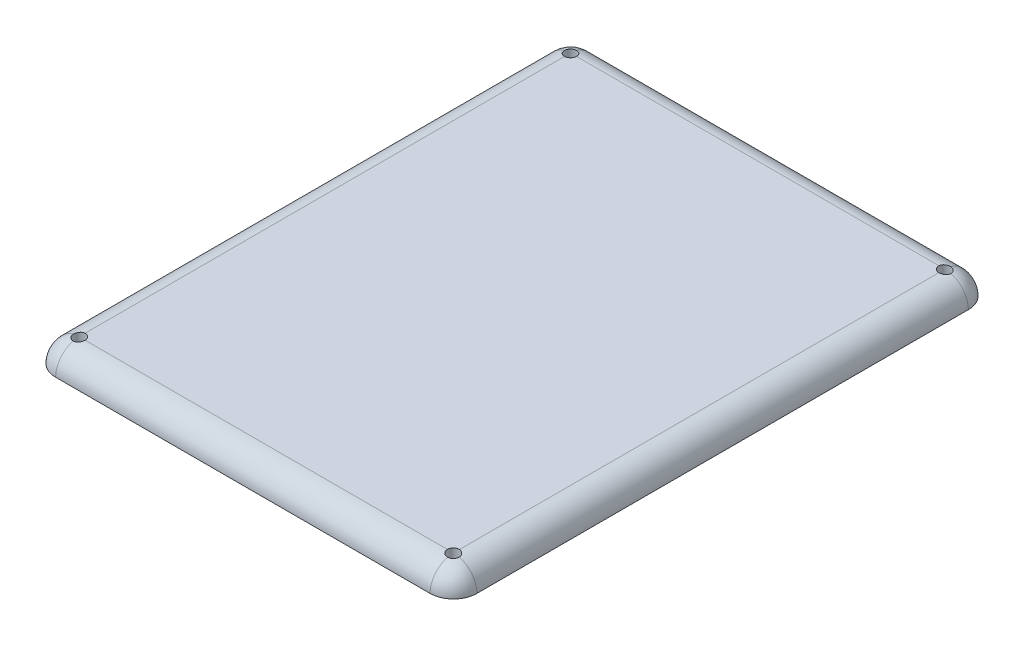
ISO-10303-21;
HEADER;
FILE_DESCRIPTION(('STEP AP214'),'2;1');
FILE_NAME('part.step','',(''),(''),'','','');
FILE_SCHEMA(('AUTOMOTIVE_DESIGN { 1 0 10303 214 1 1 1 1 }'));
ENDSEC;
DATA;
#1=APPLICATION_CONTEXT('core data for automotive mechanical design processes');
#2=APPLICATION_PROTOCOL_DEFINITION('international standard','automotive_design',2000,#1);
#3=PRODUCT_CONTEXT('',#1,'mechanical');
#4=PRODUCT('Part','Part','',(#3));
#5=PRODUCT_RELATED_PRODUCT_CATEGORY('part','',(#4));
#6=PRODUCT_DEFINITION_FORMATION('','',#4);
#7=PRODUCT_DEFINITION_CONTEXT('part definition',#1,'design');
#8=PRODUCT_DEFINITION('design','',#6,#7);
#9=PRODUCT_DEFINITION_SHAPE('','',#8);
#10=(LENGTH_UNIT() NAMED_UNIT(*) SI_UNIT(.MILLI.,.METRE.));
#11=(NAMED_UNIT(*) PLANE_ANGLE_UNIT() SI_UNIT($,.RADIAN.));
#12=(NAMED_UNIT(*) SI_UNIT($,.STERADIAN.) SOLID_ANGLE_UNIT());
#13=UNCERTAINTY_MEASURE_WITH_UNIT(LENGTH_MEASURE(1.E-05),#10,'distance_accuracy_value','');
#14=(GEOMETRIC_REPRESENTATION_CONTEXT(3) GLOBAL_UNCERTAINTY_ASSIGNED_CONTEXT((#13)) GLOBAL_UNIT_ASSIGNED_CONTEXT((#10,
#11,#12)) REPRESENTATION_CONTEXT('',''));
#15=CARTESIAN_POINT('',(0.,0.,0.));
#16=DIRECTION('',(0.,0.,1.));
#17=DIRECTION('',(1.,0.,0.));
#18=AXIS2_PLACEMENT_3D('',#15,#16,#17);
#19=CARTESIAN_POINT('',(0.,-2.5,33.4666536167725));
#20=DIRECTION('',(-1.,0.,0.));
#21=DIRECTION('',(0.,0.,1.));
#22=AXIS2_PLACEMENT_3D('',#19,#20,#21);
#23=CYLINDRICAL_SURFACE('',#22,2.5);
#24=DIRECTION('',(-1.,0.,0.));
#25=VECTOR('',#24,1.);
#26=CARTESIAN_POINT('',(0.,-5.,33.4666536167725));
#27=LINE('',#26,#25);
#28=CARTESIAN_POINT('',(40.,-5.,33.4666536167725));
#29=VERTEX_POINT('',#28);
#30=CARTESIAN_POINT('',(14.5,-5.,33.4666536167725));
#31=VERTEX_POINT('',#30);
#32=EDGE_CURVE('E208',#29,#31,#27,.T.);
#33=ORIENTED_EDGE('',*,*,#32,.T.);
#34=CARTESIAN_POINT('',(14.5,-2.5,33.4666536167725));
#35=DIRECTION('',(1.,0.,0.));
#36=DIRECTION('',(0.,0.,-1.));
#37=AXIS2_PLACEMENT_3D('',#34,#35,#36);
#38=CIRCLE('',#37,2.5);
#39=CARTESIAN_POINT('',(14.5,-2.5,30.9666536167725));
#40=VERTEX_POINT('',#39);
#41=EDGE_CURVE('E222',#40,#31,#38,.F.);
#42=ORIENTED_EDGE('',*,*,#41,.F.);
#43=DIRECTION('',(1.,0.,0.));
#44=VECTOR('',#43,1.);
#45=CARTESIAN_POINT('',(0.,-2.5,30.9666536167725));
#46=LINE('',#45,#44);
#47=CARTESIAN_POINT('',(40.,-2.5,30.9666536167725));
#48=VERTEX_POINT('',#47);
#49=EDGE_CURVE('E219',#48,#40,#46,.F.);
#50=ORIENTED_EDGE('',*,*,#49,.F.);
#51=CARTESIAN_POINT('',(40.,-2.5,33.4666536167725));
#52=DIRECTION('',(-1.,0.,0.));
#53=DIRECTION('',(0.,0.,1.));
#54=AXIS2_PLACEMENT_3D('',#51,#52,#53);
#55=CIRCLE('',#54,2.5);
#56=EDGE_CURVE('E156',#29,#48,#55,.F.);
#57=ORIENTED_EDGE('',*,*,#56,.F.);
#58=EDGE_LOOP('',(#33,#42,#50,#57));
#59=FACE_BOUND('',#58,.T.);
#60=ADVANCED_FACE('F33',(#59),#23,.T.);
#61=CARTESIAN_POINT('',(0.,-2.5,33.4666536167725));
#62=DIRECTION('',(1.,0.,0.));
#63=DIRECTION('',(0.,0.,-1.));
#64=AXIS2_PLACEMENT_3D('',#61,#62,#63);
#65=CYLINDRICAL_SURFACE('',#64,2.5);
#66=ORIENTED_EDGE('',*,*,#32,.F.);
#67=CARTESIAN_POINT('',(40.,-2.5,33.4666536167725));
#68=DIRECTION('',(-1.,0.,0.));
#69=DIRECTION('',(0.,0.,1.));
#70=AXIS2_PLACEMENT_3D('',#67,#68,#69);
#71=CIRCLE('',#70,2.5);
#72=CARTESIAN_POINT('',(40.,-2.5,35.9666536167725));
#73=VERTEX_POINT('',#72);
#74=EDGE_CURVE('E214',#73,#29,#71,.F.);
#75=ORIENTED_EDGE('',*,*,#74,.F.);
#76=DIRECTION('',(-1.,0.,0.));
#77=VECTOR('',#76,1.);
#78=CARTESIAN_POINT('',(0.,-2.5,35.9666536167725));
#79=LINE('',#78,#77);
#80=CARTESIAN_POINT('',(14.5,-2.5,35.9666536167725));
#81=VERTEX_POINT('',#80);
#82=EDGE_CURVE('E211',#81,#73,#79,.F.);
#83=ORIENTED_EDGE('',*,*,#82,.F.);
#84=CARTESIAN_POINT('',(14.5,-2.5,33.4666536167725));
#85=DIRECTION('',(1.,0.,0.));
#86=DIRECTION('',(0.,0.,-1.));
#87=AXIS2_PLACEMENT_3D('',#84,#85,#86);
#88=CIRCLE('',#87,2.5);
#89=EDGE_CURVE('E217',#31,#81,#88,.F.);
#90=ORIENTED_EDGE('',*,*,#89,.F.);
#91=EDGE_LOOP('',(#66,#75,#83,#90));
#92=FACE_BOUND('',#91,.T.);
#93=ADVANCED_FACE('F375',(#92),#65,.T.);
#94=CARTESIAN_POINT('',(0.,0.,0.));
#95=DIRECTION('',(0.,1.,0.));
#96=DIRECTION('',(0.,0.,1.));
#97=AXIS2_PLACEMENT_3D('',#94,#95,#96);
#98=PLANE('',#97);
#99=CARTESIAN_POINT('',(-40.,0.,-52.5));
#100=DIRECTION('',(0.,-1.,0.));
#101=DIRECTION('',(0.,0.,-1.));
#102=AXIS2_PLACEMENT_3D('',#99,#100,#101);
#103=CIRCLE('',#102,1.27);
#104=CARTESIAN_POINT('',(-40.,0.,-53.77));
#105=VERTEX_POINT('',#104);
#106=EDGE_CURVE('E523',#105,#105,#103,.T.);
#107=ORIENTED_EDGE('',*,*,#106,.F.);
#108=EDGE_LOOP('',(#107));
#109=FACE_BOUND('',#108,.T.);
#110=CARTESIAN_POINT('',(40.0039696980953,0.,-52.4698330388507));
#111=DIRECTION('',(0.,-1.,0.));
#112=DIRECTION('',(0.,0.,-1.));
#113=AXIS2_PLACEMENT_3D('',#110,#111,#112);
#114=CIRCLE('',#113,1.27);
#115=CARTESIAN_POINT('',(40.0039696980953,0.,-53.7398330388507));
#116=VERTEX_POINT('',#115);
#117=EDGE_CURVE('E526',#116,#116,#114,.T.);
#118=ORIENTED_EDGE('',*,*,#117,.F.);
#119=EDGE_LOOP('',(#118));
#120=FACE_BOUND('',#119,.T.);
#121=CARTESIAN_POINT('',(39.961684065126,0.,52.4945241091819));
#122=DIRECTION('',(0.,-1.,0.));
#123=DIRECTION('',(0.,0.,-1.));
#124=AXIS2_PLACEMENT_3D('',#121,#122,#123);
#125=CIRCLE('',#124,1.27);
#126=CARTESIAN_POINT('',(39.961684065126,0.,51.2245241091819));
#127=VERTEX_POINT('',#126);
#128=EDGE_CURVE('E534',#127,#127,#125,.T.);
#129=ORIENTED_EDGE('',*,*,#128,.F.);
#130=EDGE_LOOP('',(#129));
#131=FACE_BOUND('',#130,.T.);
#132=CARTESIAN_POINT('',(-39.9807499635397,0.,52.4822003056882));
#133=DIRECTION('',(0.,-1.,0.));
#134=DIRECTION('',(0.,0.,-1.));
#135=AXIS2_PLACEMENT_3D('',#132,#133,#134);
#136=CIRCLE('',#135,1.27);
#137=CARTESIAN_POINT('',(-39.9807499635397,0.,51.2122003056882));
#138=VERTEX_POINT('',#137);
#139=EDGE_CURVE('E531',#138,#138,#136,.T.);
#140=ORIENTED_EDGE('',*,*,#139,.F.);
#141=EDGE_LOOP('',(#140));
#142=FACE_BOUND('',#141,.T.);
#143=DIRECTION('',(0.,0.,1.));
#144=VECTOR('',#143,1.);
#145=CARTESIAN_POINT('',(-45.,0.,-57.5));
#146=LINE('',#145,#144);
#147=CARTESIAN_POINT('',(-45.,0.,-52.5));
#148=VERTEX_POINT('',#147);
#149=CARTESIAN_POINT('',(-45.,0.,52.5));
#150=VERTEX_POINT('',#149);
#151=EDGE_CURVE('E257',#148,#150,#146,.T.);
#152=ORIENTED_EDGE('',*,*,#151,.F.);
#153=CARTESIAN_POINT('',(-40.,0.,-52.5));
#154=DIRECTION('',(0.,1.,0.));
#155=DIRECTION('',(0.,0.,1.));
#156=AXIS2_PLACEMENT_3D('',#153,#154,#155);
#157=CIRCLE('',#156,5.);
#158=CARTESIAN_POINT('',(-40.,0.,-57.5));
#159=VERTEX_POINT('',#158);
#160=EDGE_CURVE('E194',#148,#159,#157,.F.);
#161=ORIENTED_EDGE('',*,*,#160,.T.);
#162=DIRECTION('',(-1.,0.,0.));
#163=VECTOR('',#162,1.);
#164=CARTESIAN_POINT('',(-45.,0.,-57.5));
#165=LINE('',#164,#163);
#166=CARTESIAN_POINT('',(39.9999999999999,0.,-57.5));
#167=VERTEX_POINT('',#166);
#168=EDGE_CURVE('E254',#167,#159,#165,.T.);
#169=ORIENTED_EDGE('',*,*,#168,.F.);
#170=CARTESIAN_POINT('',(40.,0.,-52.5));
#171=DIRECTION('',(0.,1.,0.));
#172=DIRECTION('',(0.,0.,1.));
#173=AXIS2_PLACEMENT_3D('',#170,#171,#172);
#174=CIRCLE('',#173,5.);
#175=CARTESIAN_POINT('',(45.,0.,-52.5));
#176=VERTEX_POINT('',#175);
#177=EDGE_CURVE('E191',#167,#176,#174,.F.);
#178=ORIENTED_EDGE('',*,*,#177,.T.);
#179=DIRECTION('',(0.,0.,-1.));
#180=VECTOR('',#179,1.);
#181=CARTESIAN_POINT('',(45.,0.,-57.5));
#182=LINE('',#181,#180);
#183=CARTESIAN_POINT('',(45.,0.,52.5));
#184=VERTEX_POINT('',#183);
#185=EDGE_CURVE('E251',#184,#176,#182,.T.);
#186=ORIENTED_EDGE('',*,*,#185,.F.);
#187=CARTESIAN_POINT('',(40.,0.,52.5));
#188=DIRECTION('',(0.,1.,0.));
#189=DIRECTION('',(0.,0.,1.));
#190=AXIS2_PLACEMENT_3D('',#187,#188,#189);
#191=CIRCLE('',#190,5.);
#192=CARTESIAN_POINT('',(40.,0.,57.5));
#193=VERTEX_POINT('',#192);
#194=EDGE_CURVE('E184',#184,#193,#191,.F.);
#195=ORIENTED_EDGE('',*,*,#194,.T.);
#196=DIRECTION('',(1.,0.,0.));
#197=VECTOR('',#196,1.);
#198=CARTESIAN_POINT('',(-45.,0.,57.5));
#199=LINE('',#198,#197);
#200=CARTESIAN_POINT('',(-40.,0.,57.5));
#201=VERTEX_POINT('',#200);
#202=EDGE_CURVE('E259',#201,#193,#199,.T.);
#203=ORIENTED_EDGE('',*,*,#202,.F.);
#204=CARTESIAN_POINT('',(-40.,0.,52.5));
#205=DIRECTION('',(0.,1.,0.));
#206=DIRECTION('',(0.,0.,1.));
#207=AXIS2_PLACEMENT_3D('',#204,#205,#206);
#208=CIRCLE('',#207,5.);
#209=EDGE_CURVE('E170',#201,#150,#208,.F.);
#210=ORIENTED_EDGE('',*,*,#209,.T.);
#211=EDGE_LOOP('',(#152,#161,#169,#178,#186,#195,#203,#210));
#212=FACE_BOUND('',#211,.T.);
#213=DIRECTION('',(0.,0.,1.));
#214=VECTOR('',#213,1.);
#215=CARTESIAN_POINT('',(40.,0.,35.9666536167725));
#216=LINE('',#215,#214);
#217=CARTESIAN_POINT('',(40.,0.,30.9666536167725));
#218=VERTEX_POINT('',#217);
#219=CARTESIAN_POINT('',(40.,0.,35.9666536167725));
#220=VERTEX_POINT('',#219);
#221=EDGE_CURVE('E359',#218,#220,#216,.T.);
#222=ORIENTED_EDGE('',*,*,#221,.F.);
#223=DIRECTION('',(1.,0.,0.));
#224=VECTOR('',#223,1.);
#225=CARTESIAN_POINT('',(14.5,0.,30.9666536167725));
#226=LINE('',#225,#224);
#227=CARTESIAN_POINT('',(14.5,0.,30.9666536167725));
#228=VERTEX_POINT('',#227);
#229=EDGE_CURVE('E239',#228,#218,#226,.T.);
#230=ORIENTED_EDGE('',*,*,#229,.F.);
#231=DIRECTION('',(0.,0.,-1.));
#232=VECTOR('',#231,1.);
#233=CARTESIAN_POINT('',(14.5,0.,35.9666536167725));
#234=LINE('',#233,#232);
#235=CARTESIAN_POINT('',(14.5,0.,35.9666536167725));
#236=VERTEX_POINT('',#235);
#237=EDGE_CURVE('E244',#236,#228,#234,.T.);
#238=ORIENTED_EDGE('',*,*,#237,.F.);
#239=DIRECTION('',(-1.,0.,0.));
#240=VECTOR('',#239,1.);
#241=CARTESIAN_POINT('',(14.5,0.,35.9666536167725));
#242=LINE('',#241,#240);
#243=EDGE_CURVE('E362',#220,#236,#242,.T.);
#244=ORIENTED_EDGE('',*,*,#243,.F.);
#245=EDGE_LOOP('',(#222,#230,#238,#244));
#246=FACE_BOUND('',#245,.T.);
#247=ADVANCED_FACE('F273',(#109,#120,#131,#142,#212,#246),#98,.F.);
#248=CARTESIAN_POINT('',(-45.,0.,-52.5));
#249=DIRECTION('',(-1.,0.,0.));
#250=DIRECTION('',(0.,0.,1.));
#251=AXIS2_PLACEMENT_3D('',#248,#249,#250);
#252=CYLINDRICAL_SURFACE('',#251,5.);
#253=CARTESIAN_POINT('',(-38.73,5.,-52.5));
#254=CARTESIAN_POINT('',(-38.7299995996187,5.00000203295582,-52.5351321659607));
#255=CARTESIAN_POINT('',(-38.7314587312449,4.99962926670162,-52.5702469753213));
#256=CARTESIAN_POINT('',(-38.7372756058334,4.99815578087302,-52.6402147633546));
#257=CARTESIAN_POINT('',(-38.7416328882991,4.99705517694723,-52.6750677827344));
#258=CARTESIAN_POINT('',(-38.758988553853,4.99270226991928,-52.7787106859159));
#259=CARTESIAN_POINT('',(-38.7762710338951,4.98839862258342,-52.8467896044364));
#260=CARTESIAN_POINT('',(-38.8217032861913,4.9774494279623,-52.9789661902547));
#261=CARTESIAN_POINT('',(-38.8498526788867,4.97080396247258,-53.0430639965137));
#262=CARTESIAN_POINT('',(-38.9161817712107,4.95587736130695,-53.1656534732563));
#263=CARTESIAN_POINT('',(-38.9543642127523,4.94759577865341,-53.224143605256));
#264=CARTESIAN_POINT('',(-39.0405188259083,4.93010099562295,-53.3350573889194));
#265=CARTESIAN_POINT('',(-39.0886621435057,4.92087316378342,-53.3873457295386));
#266=CARTESIAN_POINT('',(-39.1930144880968,4.90262087894723,-53.4832062749795));
#267=CARTESIAN_POINT('',(-39.2492253152075,4.89359647186246,-53.5267765293113));
#268=CARTESIAN_POINT('',(-39.369188431991,4.87662255739769,-53.6046128484418));
#269=CARTESIAN_POINT('',(-39.4330451012587,4.86869211136373,-53.6387224043327));
#270=CARTESIAN_POINT('',(-39.5658019089936,4.85502668785504,-53.6956496106856));
#271=CARTESIAN_POINT('',(-39.6346978711574,4.84928991639445,-53.7184764926021));
#272=CARTESIAN_POINT('',(-39.7532993442147,4.84207012799078,-53.7467959756724));
#273=CARTESIAN_POINT('',(-39.802218613147,4.83981654105899,-53.7554832706852));
#274=CARTESIAN_POINT('',(-39.900749668177,4.83678554243176,-53.7670892556901));
#275=CARTESIAN_POINT('',(-39.9503610019617,4.83600720826293,-53.7700115505749));
#276=CARTESIAN_POINT('',(-40.,4.83602109176542,-53.77));
#277=B_SPLINE_CURVE_WITH_KNOTS('',3,(#253,#254,#255,#256,#257,#258,#259,#260,#261,#262,#263,
#264,#265,#266,#267,#268,#269,#270,#271,#272,#273,#274,#275,#276),.UNSPECIFIED.,.F.,.F.,(4,2,2,
2,2,2,2,2,2,2,2,4),(0.,0.105330059980314,0.210643387725724,0.420662498770928,0.630674274948831,
0.840743504650465,1.05477698383368,1.26885829513099,1.48629453405159,1.70355257148928,
1.8524189257438,2.00119216333591),.UNSPECIFIED.);
#278=CARTESIAN_POINT('',(-38.73,5.,-52.5));
#279=VERTEX_POINT('',#278);
#280=CARTESIAN_POINT('',(-40.,4.83602109176542,-53.77));
#281=VERTEX_POINT('',#280);
#282=EDGE_CURVE('E353',#279,#281,#277,.T.);
#283=ORIENTED_EDGE('',*,*,#282,.F.);
#284=DIRECTION('',(1.,0.,0.));
#285=VECTOR('',#284,1.);
#286=CARTESIAN_POINT('',(-45.,5.,-52.5));
#287=LINE('',#286,#285);
#288=CARTESIAN_POINT('',(38.734328034296,5.,-52.5));
#289=VERTEX_POINT('',#288);
#290=EDGE_CURVE('E197',#289,#279,#287,.F.);
#291=ORIENTED_EDGE('',*,*,#290,.F.);
#292=CARTESIAN_POINT('',(39.9999999999999,4.84384448759005,-53.7398268347005));
#293=CARTESIAN_POINT('',(39.9648448586189,4.84387021694012,-53.7397173670911));
#294=CARTESIAN_POINT('',(39.9297120286387,4.84427482824108,-53.7381464766285));
#295=CARTESIAN_POINT('',(39.8597188650228,4.84581628957946,-53.7321033349272));
#296=CARTESIAN_POINT('',(39.8248584863198,4.84695301580355,-53.727631574275));
#297=CARTESIAN_POINT('',(39.7212103751411,4.85141467176838,-53.7099306473658));
#298=CARTESIAN_POINT('',(39.6531494915465,4.8557915344908,-53.6924149080751));
#299=CARTESIAN_POINT('',(39.521049969666,4.86683138146361,-53.6465172489853));
#300=CARTESIAN_POINT('',(39.4570110213717,4.87349418925818,-53.6181361678801));
#301=CARTESIAN_POINT('',(39.3345678544691,4.88833757989485,-53.5513431495097));
#302=CARTESIAN_POINT('',(39.2761652269163,4.89651858941049,-53.5129283911525));
#303=CARTESIAN_POINT('',(39.1654234326997,4.91365433924292,-53.4262744450445));
#304=CARTESIAN_POINT('',(39.1132243320918,4.92262103579727,-53.3778586666855));
#305=CARTESIAN_POINT('',(39.0175905836341,4.94017957244828,-53.2729484585746));
#306=CARTESIAN_POINT('',(38.9741579737401,4.9487713250183,-53.2164521555378));
#307=CARTESIAN_POINT('',(38.8967661255866,4.96471720649954,-53.096081910014));
#308=CARTESIAN_POINT('',(38.862937913315,4.97205372097617,-53.0321213097886));
#309=CARTESIAN_POINT('',(38.8065897725286,4.98448147718996,-52.8992255091518));
#310=CARTESIAN_POINT('',(38.7840589779245,4.98957487582594,-52.8302951620338));
#311=CARTESIAN_POINT('',(38.7575507309066,4.99545696863117,-52.7173386553749));
#312=CARTESIAN_POINT('',(38.7497603895719,4.99715120710975,-52.6742180535728));
#313=CARTESIAN_POINT('',(38.738668809711,4.99942538390627,-52.5874237463061));
#314=CARTESIAN_POINT('',(38.7353625725409,5.00000656330252,-52.5437507115934));
#315=CARTESIAN_POINT('',(38.734328034296,5.,-52.5));
#316=B_SPLINE_CURVE_WITH_KNOTS('',3,(#292,#293,#294,#295,#296,#297,#298,#299,#300,#301,#302,
#303,#304,#305,#306,#307,#308,#309,#310,#311,#312,#313,#314,#315),.UNSPECIFIED.,.F.,.F.,(4,2,2,
2,2,2,2,2,2,2,2,4),(0.,0.105399304695815,0.210780789219215,0.420933299000074,0.631069590415775,
0.841265027957935,1.05554972200494,1.26988417382109,1.48701572672835,1.70393803550145,
1.8352652745166,1.9664459961555),.UNSPECIFIED.);
#317=CARTESIAN_POINT('',(40.,4.84384448759005,-53.7398268347005));
#318=VERTEX_POINT('',#317);
#319=EDGE_CURVE('E297',#318,#289,#316,.T.);
#320=ORIENTED_EDGE('',*,*,#319,.F.);
#321=CARTESIAN_POINT('',(40.,0.,-52.5));
#322=DIRECTION('',(1.,0.,0.));
#323=DIRECTION('',(0.,0.,-1.));
#324=AXIS2_PLACEMENT_3D('',#321,#322,#323);
#325=CIRCLE('',#324,5.);
#326=EDGE_CURVE('E205',#167,#318,#325,.T.);
#327=ORIENTED_EDGE('',*,*,#326,.F.);
#328=ORIENTED_EDGE('',*,*,#168,.T.);
#329=CARTESIAN_POINT('',(-40.,0.,-52.5));
#330=DIRECTION('',(1.,0.,0.));
#331=DIRECTION('',(0.,0.,-1.));
#332=AXIS2_PLACEMENT_3D('',#329,#330,#331);
#333=CIRCLE('',#332,5.);
#334=EDGE_CURVE('E202',#159,#281,#333,.T.);
#335=ORIENTED_EDGE('',*,*,#334,.T.);
#336=EDGE_LOOP('',(#283,#291,#320,#327,#328,#335));
#337=FACE_BOUND('',#336,.T.);
#338=ADVANCED_FACE('F343',(#337),#252,.T.);
#339=CARTESIAN_POINT('',(-40.,0.,-52.5));
#340=DIRECTION('',(0.,0.,1.));
#341=DIRECTION('',(1.,0.,0.));
#342=AXIS2_PLACEMENT_3D('',#339,#340,#341);
#343=SPHERICAL_SURFACE('',#342,5.);
#344=CARTESIAN_POINT('',(-40.,4.83602109176542,-52.5));
#345=DIRECTION('',(0.,-1.,0.));
#346=DIRECTION('',(0.,0.,-1.));
#347=AXIS2_PLACEMENT_3D('',#344,#345,#346);
#348=CIRCLE('',#347,1.27);
#349=CARTESIAN_POINT('',(-41.27,4.83602109176542,-52.5));
#350=VERTEX_POINT('',#349);
#351=EDGE_CURVE('E360',#281,#350,#348,.F.);
#352=ORIENTED_EDGE('',*,*,#351,.F.);
#353=ORIENTED_EDGE('',*,*,#334,.F.);
#354=ORIENTED_EDGE('',*,*,#160,.F.);
#355=CARTESIAN_POINT('',(-40.,0.,-52.5));
#356=DIRECTION('',(0.,0.,1.));
#357=DIRECTION('',(1.,0.,0.));
#358=AXIS2_PLACEMENT_3D('',#355,#356,#357);
#359=CIRCLE('',#358,5.);
#360=EDGE_CURVE('E189',#350,#148,#359,.T.);
#361=ORIENTED_EDGE('',*,*,#360,.F.);
#362=EDGE_LOOP('',(#352,#353,#354,#361));
#363=FACE_BOUND('',#362,.T.);
#364=ADVANCED_FACE('F347',(#363),#343,.T.);
#365=CARTESIAN_POINT('',(40.,0.,-52.5));
#366=DIRECTION('',(0.,0.,1.));
#367=DIRECTION('',(1.,0.,0.));
#368=AXIS2_PLACEMENT_3D('',#365,#366,#367);
#369=SPHERICAL_SURFACE('',#368,5.);
#370=CARTESIAN_POINT('',(41.2736160981766,4.83507000926205,-52.4998));
#371=CARTESIAN_POINT('',(41.272772736697,4.83529357608201,-52.5355216151164));
#372=CARTESIAN_POINT('',(41.270421763136,4.83551803603645,-52.5711905172025));
#373=CARTESIAN_POINT('',(41.2627253150764,4.83596734714724,-52.6422019978976));
#374=CARTESIAN_POINT('',(41.2573799841018,4.83619219828433,-52.6775445920647));
#375=CARTESIAN_POINT('',(41.2369055919987,4.83686454304082,-52.7826417887341));
#376=CARTESIAN_POINT('',(41.2173352164084,4.8373105698389,-52.8515843207398));
#377=CARTESIAN_POINT('',(41.1668981055198,4.83818517131952,-52.9852033688616));
#378=CARTESIAN_POINT('',(41.1360259312434,4.83861373748861,-53.0498778132483));
#379=CARTESIAN_POINT('',(41.0638650330066,4.83944125768495,-53.1731231095541));
#380=CARTESIAN_POINT('',(41.0225782768531,4.83984021728786,-53.2316951115622));
#381=CARTESIAN_POINT('',(40.9307604264063,4.84059722469046,-53.3410727804715));
#382=CARTESIAN_POINT('',(40.880229615333,4.84095527374302,-53.3918786852235));
#383=CARTESIAN_POINT('',(40.7713408541869,4.84162044662066,-53.4842989195479));
#384=CARTESIAN_POINT('',(40.712981049052,4.84192755833757,-53.5259110644755));
#385=CARTESIAN_POINT('',(40.5900963722029,4.84248210819778,-53.5987532964082));
#386=CARTESIAN_POINT('',(40.5255700685369,4.84272953243353,-53.6299809644061));
#387=CARTESIAN_POINT('',(40.3922086472042,4.84315751186499,-53.6811387653668));
#388=CARTESIAN_POINT('',(40.3233767422621,4.84333811624019,-53.7010772129652));
#389=CARTESIAN_POINT('',(40.211656966363,4.84356909928146,-53.7234615911803));
#390=CARTESIAN_POINT('',(40.1694960460023,4.84364262532504,-53.7297189898303));
#391=CARTESIAN_POINT('',(40.084827251508,4.84376339820416,-53.7379690371622));
#392=CARTESIAN_POINT('',(40.0423200420688,4.84381068698662,-53.7399685078357));
#393=CARTESIAN_POINT('',(39.9997999999999,4.8438446475055,-53.7398261937999));
#394=B_SPLINE_CURVE_WITH_KNOTS('',3,(#370,#371,#372,#373,#374,#375,#376,#377,#378,#379,#380,
#381,#382,#383,#384,#385,#386,#387,#388,#389,#390,#391,#392,#393),.UNSPECIFIED.,.F.,.F.,(4,2,2,
2,2,2,2,2,2,2,2,4),(0.,0.107130963004776,0.214256791502175,0.428157314947688,0.64216091339479,
0.856124106690702,1.07008074566348,1.28408817101018,1.49814541335296,1.71204479440481,
1.8397175613818,1.96718561848273),.UNSPECIFIED.);
#395=CARTESIAN_POINT('',(41.2736113618946,4.83507126099016,-52.5));
#396=VERTEX_POINT('',#395);
#397=EDGE_CURVE('E295',#396,#318,#394,.T.);
#398=ORIENTED_EDGE('',*,*,#397,.F.);
#399=CARTESIAN_POINT('',(40.,0.,-52.5));
#400=DIRECTION('',(0.,0.,-1.));
#401=DIRECTION('',(-1.,0.,0.));
#402=AXIS2_PLACEMENT_3D('',#399,#400,#401);
#403=CIRCLE('',#402,5.);
#404=EDGE_CURVE('E199',#176,#396,#403,.F.);
#405=ORIENTED_EDGE('',*,*,#404,.F.);
#406=ORIENTED_EDGE('',*,*,#177,.F.);
#407=ORIENTED_EDGE('',*,*,#326,.T.);
#408=EDGE_LOOP('',(#398,#405,#406,#407));
#409=FACE_BOUND('',#408,.T.);
#410=ADVANCED_FACE('F349',(#409),#369,.T.);
#411=CARTESIAN_POINT('',(40.,0.,-57.5));
#412=DIRECTION('',(0.,0.,-1.));
#413=DIRECTION('',(-1.,0.,0.));
#414=AXIS2_PLACEMENT_3D('',#411,#412,#413);
#415=CYLINDRICAL_SURFACE('',#414,5.);
#416=CARTESIAN_POINT('',(40.,5.,-51.1998392430009));
#417=CARTESIAN_POINT('',(40.0351290339948,5.00000203251723,-51.1997290370749));
#418=CARTESIAN_POINT('',(40.070245285554,4.99962933175562,-51.2010781661231));
#419=CARTESIAN_POINT('',(40.1402250842158,4.99815553412318,-51.2066753529627));
#420=CARTESIAN_POINT('',(40.1750886704344,4.99705455254525,-51.2109229519057));
#421=CARTESIAN_POINT('',(40.2787757958842,4.99269903344248,-51.2279515257193));
#422=CARTESIAN_POINT('',(40.3469018843077,4.98839167791927,-51.2450179134868));
#423=CARTESIAN_POINT('',(40.4792071374488,4.97742709843985,-51.2900279315692));
#424=CARTESIAN_POINT('',(40.5433864360846,4.97076995426592,-51.3179711925854));
#425=CARTESIAN_POINT('',(40.6661715583113,4.95580898731797,-51.3839029501204));
#426=CARTESIAN_POINT('',(40.7247757703665,4.94750469054477,-51.4218943392289));
#427=CARTESIAN_POINT('',(40.8359505269562,4.92995119337142,-51.5076835289175));
#428=CARTESIAN_POINT('',(40.8883861434812,4.92068710390797,-51.5556530568275));
#429=CARTESIAN_POINT('',(40.9845663374848,4.90234954535367,-51.6596794702949));
#430=CARTESIAN_POINT('',(41.0283093670852,4.89327611046923,-51.7157377931519));
#431=CARTESIAN_POINT('',(41.1065268374182,4.8761903524715,-51.8354358542976));
#432=CARTESIAN_POINT('',(41.1408432746344,4.86819714099412,-51.8991817332698));
#433=CARTESIAN_POINT('',(41.1982061213967,4.85439757019513,-52.0317593192806));
#434=CARTESIAN_POINT('',(41.2212598814122,4.84858978514787,-52.1005876754327));
#435=CARTESIAN_POINT('',(41.25130131711,4.84091244271311,-52.2246422152696));
#436=CARTESIAN_POINT('',(41.260798974104,4.83843638288464,-52.2792363182903));
#437=CARTESIAN_POINT('',(41.2726219095893,4.83533116823505,-52.3892411643202));
#438=CARTESIAN_POINT('',(41.2749477698873,4.83470186359751,-52.4446518407189));
#439=CARTESIAN_POINT('',(41.2736113618946,4.83507126099016,-52.5));
#440=B_SPLINE_CURVE_WITH_KNOTS('',3,(#416,#417,#418,#419,#420,#421,#422,#423,#424,#425,#426,
#427,#428,#429,#430,#431,#432,#433,#434,#435,#436,#437,#438,#439),.UNSPECIFIED.,.F.,.F.,(4,2,2,
2,2,2,2,2,2,2,2,4),(0.,0.105321209318235,0.210625749404867,0.420624345135475,0.630615811478709,
0.8406677947217,1.05468868283313,1.26874764729861,1.48620159884873,1.70351344110764,
1.86943940786819,2.03535191365516),.UNSPECIFIED.);
#441=CARTESIAN_POINT('',(40.,5.,-51.1998392430009));
#442=VERTEX_POINT('',#441);
#443=EDGE_CURVE('E292',#442,#396,#440,.T.);
#444=ORIENTED_EDGE('',*,*,#443,.F.);
#445=DIRECTION('',(0.,0.,1.));
#446=VECTOR('',#445,1.);
#447=CARTESIAN_POINT('',(40.,5.,-57.5));
#448=LINE('',#447,#446);
#449=CARTESIAN_POINT('',(40.,5.,51.225102237173));
#450=VERTEX_POINT('',#449);
#451=EDGE_CURVE('E172',#450,#442,#448,.F.);
#452=ORIENTED_EDGE('',*,*,#451,.F.);
#453=CARTESIAN_POINT('',(41.2316722598033,4.84592441588095,52.5));
#454=CARTESIAN_POINT('',(41.2318242099097,4.84588350914998,52.4648545016178));
#455=CARTESIAN_POINT('',(41.230515415421,4.84621868337919,52.4297196635229));
#456=CARTESIAN_POINT('',(41.2249956911847,4.84761777122258,52.3596990303946));
#457=CARTESIAN_POINT('',(41.2207852382419,4.84868156510873,52.3248131953962));
#458=CARTESIAN_POINT('',(41.2038623644401,4.85292275449124,52.2210531858894));
#459=CARTESIAN_POINT('',(41.1868590362807,4.85715000299196,52.1528712620706));
#460=CARTESIAN_POINT('',(41.1419563961496,4.86790108594956,52.0204421491884));
#461=CARTESIAN_POINT('',(41.1140576963725,4.8744247913699,51.9561947392851));
#462=CARTESIAN_POINT('',(41.0481880530312,4.88901176125209,51.8332589618242));
#463=CARTESIAN_POINT('',(41.0102143552581,4.89707544653013,51.7745721203257));
#464=CARTESIAN_POINT('',(40.9244157156901,4.91400028356667,51.6632097716243));
#465=CARTESIAN_POINT('',(40.8764165848422,4.922873718432,51.6106703759941));
#466=CARTESIAN_POINT('',(40.7722844175113,4.94027917543136,51.5142891963375));
#467=CARTESIAN_POINT('',(40.7161494619191,4.94881111640487,51.4704494702187));
#468=CARTESIAN_POINT('',(40.596415946624,4.96467326672085,51.3921623234911));
#469=CARTESIAN_POINT('',(40.5327270667747,4.97198574777263,51.3578493192841));
#470=CARTESIAN_POINT('',(40.4002918791342,4.98439289589521,51.3004897259598));
#471=CARTESIAN_POINT('',(40.3315504600223,4.98948967462823,51.2774324070889));
#472=CARTESIAN_POINT('',(40.2185463170214,4.99540588741907,51.2499899554751));
#473=CARTESIAN_POINT('',(40.1752115117014,4.99711846061645,51.2418292496479));
#474=CARTESIAN_POINT('',(40.0879484503932,4.99941827994406,51.2300496242595));
#475=CARTESIAN_POINT('',(40.0440208973087,5.00000675807147,51.2264257338964));
#476=CARTESIAN_POINT('',(40.,5.,51.225102237173));
#477=B_SPLINE_CURVE_WITH_KNOTS('',3,(#453,#454,#455,#456,#457,#458,#459,#460,#461,#462,#463,
#464,#465,#466,#467,#468,#469,#470,#471,#472,#473,#474,#475,#476),.UNSPECIFIED.,.F.,.F.,(4,2,2,
2,2,2,2,2,2,2,2,4),(0.,0.105371046327893,0.210724782056571,0.420824551743933,0.630912517935732,
0.841057975298021,1.0552142962079,1.26942121558509,1.48651244314226,1.70339631714857,
1.83555398586043,1.9675667277675),.UNSPECIFIED.);
#478=CARTESIAN_POINT('',(41.2316722598033,4.84592441588095,52.5));
#479=VERTEX_POINT('',#478);
#480=EDGE_CURVE('E291',#479,#450,#477,.T.);
#481=ORIENTED_EDGE('',*,*,#480,.F.);
#482=CARTESIAN_POINT('',(40.,0.,52.5));
#483=DIRECTION('',(0.,0.,1.));
#484=DIRECTION('',(1.,0.,0.));
#485=AXIS2_PLACEMENT_3D('',#482,#483,#484);
#486=CIRCLE('',#485,5.);
#487=EDGE_CURVE('E186',#184,#479,#486,.T.);
#488=ORIENTED_EDGE('',*,*,#487,.F.);
#489=ORIENTED_EDGE('',*,*,#185,.T.);
#490=ORIENTED_EDGE('',*,*,#404,.T.);
#491=EDGE_LOOP('',(#444,#452,#481,#488,#489,#490));
#492=FACE_BOUND('',#491,.T.);
#493=ADVANCED_FACE('F290',(#492),#415,.T.);
#494=CARTESIAN_POINT('',(40.,0.,52.5));
#495=DIRECTION('',(-1.,0.,0.));
#496=DIRECTION('',(0.,0.,1.));
#497=AXIS2_PLACEMENT_3D('',#494,#495,#496);
#498=SPHERICAL_SURFACE('',#497,5.);
#499=CARTESIAN_POINT('',(39.9998,4.83760532662576,53.763952002175));
#500=CARTESIAN_POINT('',(40.0355152253414,4.83788699277156,53.7628793754008));
#501=CARTESIAN_POINT('',(40.0711680860608,4.83816643391957,53.7602995262813));
#502=CARTESIAN_POINT('',(40.1421283283217,4.83871914648799,53.7521475091415));
#503=CARTESIAN_POINT('',(40.177435726303,4.83899241820282,53.7465754842246));
#504=CARTESIAN_POINT('',(40.2823994995716,4.83979956139933,53.7254269819143));
#505=CARTESIAN_POINT('',(40.3512153867241,4.84032169084551,53.7054144186055));
#506=CARTESIAN_POINT('',(40.4845089715493,4.84131870955862,53.6541202733023));
#507=CARTESIAN_POINT('',(40.5489845564618,4.84179357587198,53.6228332495655));
#508=CARTESIAN_POINT('',(40.6717648483995,4.84268262113191,53.5498820289846));
#509=CARTESIAN_POINT('',(40.7300707753982,4.84309681208253,53.5082198891758));
#510=CARTESIAN_POINT('',(40.8388558612707,4.84385279546965,53.4157022790408));
#511=CARTESIAN_POINT('',(40.8893354433861,4.84419459182154,53.3648473061771));
#512=CARTESIAN_POINT('',(40.9810547648404,4.84479626716235,53.2553676809508));
#513=CARTESIAN_POINT('',(41.0222920302937,4.84505612422618,53.1967409549946));
#514=CARTESIAN_POINT('',(41.0943456856079,4.84548651033048,53.0733882625516));
#515=CARTESIAN_POINT('',(41.1251593830097,4.84565701629736,53.0086607257073));
#516=CARTESIAN_POINT('',(41.1754584305368,4.84590366350892,52.8749734067679));
#517=CARTESIAN_POINT('',(41.1949533375359,4.84597988442362,52.8060172496097));
#518=CARTESIAN_POINT('',(41.216061615596,4.84602364383251,52.6970442035347));
#519=CARTESIAN_POINT('',(41.2217713334475,4.84602441814629,52.6577773102406));
#520=CARTESIAN_POINT('',(41.2294923096031,4.84599639076055,52.5789486877173));
#521=CARTESIAN_POINT('',(41.2315098101061,4.84596763910748,52.5393875698536));
#522=CARTESIAN_POINT('',(41.2316731064078,4.84592419657506,52.4998));
#523=B_SPLINE_CURVE_WITH_KNOTS('',3,(#499,#500,#501,#502,#503,#504,#505,#506,#507,#508,#509,
#510,#511,#512,#513,#514,#515,#516,#517,#518,#519,#520,#521,#522),.UNSPECIFIED.,.F.,.F.,(4,2,2,
2,2,2,2,2,2,2,2,4),(0.,0.107131475350803,0.214257827508276,0.428161058509463,0.642167670849167,
0.856131886637412,1.07008452739424,1.28409436851613,1.49815944729846,1.71204351917366,
1.83092804116959,1.94961138627004),.UNSPECIFIED.);
#524=CARTESIAN_POINT('',(40.,4.83760690389694,53.7639459811909));
#525=VERTEX_POINT('',#524);
#526=EDGE_CURVE('E281',#525,#479,#523,.T.);
#527=ORIENTED_EDGE('',*,*,#526,.F.);
#528=CARTESIAN_POINT('',(40.,0.,52.5));
#529=DIRECTION('',(1.,0.,0.));
#530=DIRECTION('',(0.,0.,-1.));
#531=AXIS2_PLACEMENT_3D('',#528,#529,#530);
#532=CIRCLE('',#531,5.);
#533=EDGE_CURVE('E181',#193,#525,#532,.F.);
#534=ORIENTED_EDGE('',*,*,#533,.F.);
#535=ORIENTED_EDGE('',*,*,#194,.F.);
#536=ORIENTED_EDGE('',*,*,#487,.T.);
#537=EDGE_LOOP('',(#527,#534,#535,#536));
#538=FACE_BOUND('',#537,.T.);
#539=ADVANCED_FACE('F280',(#538),#498,.T.);
#540=CARTESIAN_POINT('',(-40.,0.,52.5));
#541=DIRECTION('',(1.,0.,0.));
#542=DIRECTION('',(0.,0.,-1.));
#543=AXIS2_PLACEMENT_3D('',#540,#541,#542);
#544=SPHERICAL_SURFACE('',#543,5.);
#545=CARTESIAN_POINT('',(-41.2506280091646,4.84106698390893,52.4998));
#546=CARTESIAN_POINT('',(-41.2501326175029,4.84119637565459,52.5355270244185));
#547=CARTESIAN_POINT('',(-41.2481292645723,4.84131962620391,52.5712160528106));
#548=CARTESIAN_POINT('',(-41.241125194125,4.84155310879079,52.6422970386982));
#549=CARTESIAN_POINT('',(-41.2361246201066,4.84166334145129,52.6776890103337));
#550=CARTESIAN_POINT('',(-41.2166758296967,4.84197308835505,52.7829780276438));
#551=CARTESIAN_POINT('',(-41.1977787888004,4.8421520792268,52.8521064054612));
#552=CARTESIAN_POINT('',(-41.1486477935137,4.84244970416709,52.9862077355066));
#553=CARTESIAN_POINT('',(-41.1184083712462,4.84256830905996,53.0511786658218));
#554=CARTESIAN_POINT('',(-41.0474546604369,4.84274181561639,53.1751186546705));
#555=CARTESIAN_POINT('',(-41.0067424090347,4.84279672965746,53.2340888773319));
#556=CARTESIAN_POINT('',(-40.9159992977902,4.84284130446494,53.3443534563305));
#557=CARTESIAN_POINT('',(-40.8659687922517,4.84283096771187,53.3956481043791));
#558=CARTESIAN_POINT('',(-40.7579910101363,4.8427453286888,53.4891241279727));
#559=CARTESIAN_POINT('',(-40.7000417124258,4.84267000980709,53.5313031698002));
#560=CARTESIAN_POINT('',(-40.5778756657216,4.84245651999927,53.6053416949665));
#561=CARTESIAN_POINT('',(-40.5136572175518,4.84231833199591,53.6371983703933));
#562=CARTESIAN_POINT('',(-40.3808041214022,4.84198300264445,53.689654995461));
#563=CARTESIAN_POINT('',(-40.3121730610452,4.84178590872506,53.710263963726));
#564=CARTESIAN_POINT('',(-40.2024463608909,4.84143457413453,53.7333674367408));
#565=CARTESIAN_POINT('',(-40.1621472679776,4.84129813540693,53.7398398420459));
#566=CARTESIAN_POINT('',(-40.0811811739293,4.84100941482851,53.7488770516633));
#567=CARTESIAN_POINT('',(-40.0405148954014,4.84085715968025,53.7514483311968));
#568=CARTESIAN_POINT('',(-39.9998,4.84069748814727,53.7520574221036));
#569=B_SPLINE_CURVE_WITH_KNOTS('',3,(#545,#546,#547,#548,#549,#550,#551,#552,#553,#554,#555,
#556,#557,#558,#559,#560,#561,#562,#563,#564,#565,#566,#567,#568),.UNSPECIFIED.,.F.,.F.,(4,2,2,
2,2,2,2,2,2,2,2,4),(0.,0.107126240837692,0.214247353182462,0.428139362324229,0.642134616231362,
0.856088275931225,1.07003380222365,1.28403403672536,1.49809243524741,1.71197894459511,
1.83425632416681,1.95633052068861),.UNSPECIFIED.);
#570=CARTESIAN_POINT('',(-41.2506252215404,4.84106770818661,52.5));
#571=VERTEX_POINT('',#570);
#572=CARTESIAN_POINT('',(-40.,4.84069827239818,53.7520544060069));
#573=VERTEX_POINT('',#572);
#574=EDGE_CURVE('E165',#571,#573,#569,.T.);
#575=ORIENTED_EDGE('',*,*,#574,.F.);
#576=CARTESIAN_POINT('',(-40.,0.,52.5));
#577=DIRECTION('',(0.,0.,-1.));
#578=DIRECTION('',(-1.,0.,0.));
#579=AXIS2_PLACEMENT_3D('',#576,#577,#578);
#580=CIRCLE('',#579,5.);
#581=EDGE_CURVE('E163',#150,#571,#580,.T.);
#582=ORIENTED_EDGE('',*,*,#581,.F.);
#583=ORIENTED_EDGE('',*,*,#209,.F.);
#584=CARTESIAN_POINT('',(-40.,0.,52.5));
#585=DIRECTION('',(1.,0.,0.));
#586=DIRECTION('',(0.,0.,-1.));
#587=AXIS2_PLACEMENT_3D('',#584,#585,#586);
#588=CIRCLE('',#587,5.);
#589=EDGE_CURVE('E175',#573,#201,#588,.T.);
#590=ORIENTED_EDGE('',*,*,#589,.F.);
#591=EDGE_LOOP('',(#575,#582,#583,#590));
#592=FACE_BOUND('',#591,.T.);
#593=ADVANCED_FACE('F270',(#592),#544,.T.);
#594=CARTESIAN_POINT('',(-40.,0.,-57.5));
#595=DIRECTION('',(0.,0.,1.));
#596=DIRECTION('',(1.,0.,0.));
#597=AXIS2_PLACEMENT_3D('',#594,#595,#596);
#598=CYLINDRICAL_SURFACE('',#597,5.);
#599=CARTESIAN_POINT('',(-41.27,4.83602109176542,-52.5));
#600=CARTESIAN_POINT('',(-41.2700004500397,4.83601868201476,-52.464886353621));
#601=CARTESIAN_POINT('',(-41.2685428096875,4.83640401047006,-52.429790125857));
#602=CARTESIAN_POINT('',(-41.2627321979863,4.83792526027292,-52.3598605569281));
#603=CARTESIAN_POINT('',(-41.2583797259396,4.83906105217988,-52.3250271714756));
#604=CARTESIAN_POINT('',(-41.2410448966373,4.84354813021985,-52.2214501470163));
#605=CARTESIAN_POINT('',(-41.2237848341884,4.84797941131787,-52.1534188496602));
#606=CARTESIAN_POINT('',(-41.1784177909285,4.85920465767625,-52.0213402483421));
#607=CARTESIAN_POINT('',(-41.1503118428776,4.86599839797392,-51.957292565729));
#608=CARTESIAN_POINT('',(-41.0840843680952,4.88117932534767,-51.8347862564727));
#609=CARTESIAN_POINT('',(-41.0459597081607,4.88956701067873,-51.776329386087));
#610=CARTESIAN_POINT('',(-40.95986469951,4.90720128405333,-51.6653797293147));
#611=CARTESIAN_POINT('',(-40.9117101570291,4.91646185365654,-51.6130321405775));
#612=CARTESIAN_POINT('',(-40.807310725109,4.93467854786359,-51.5170568437099));
#613=CARTESIAN_POINT('',(-40.7510643021855,4.9436346143627,-51.4734307921426));
#614=CARTESIAN_POINT('',(-40.6310669250864,4.96039052348539,-51.3955332213484));
#615=CARTESIAN_POINT('',(-40.5672177756194,4.96817142630137,-51.3614087008485));
#616=CARTESIAN_POINT('',(-40.4344755529386,4.98153261531005,-51.3044510959164));
#617=CARTESIAN_POINT('',(-40.365586459874,4.98711461624632,-51.2816092095378));
#618=CARTESIAN_POINT('',(-40.2469442924113,4.99413249193526,-51.2532500300555));
#619=CARTESIAN_POINT('',(-40.197974048389,4.99631987011269,-51.2445450134478));
#620=CARTESIAN_POINT('',(-40.0993445795624,4.99925923247388,-51.232916260234));
#621=CARTESIAN_POINT('',(-40.0496858517138,5.00001220271327,-51.2299885520806));
#622=CARTESIAN_POINT('',(-40.,5.,-51.23));
#623=B_SPLINE_CURVE_WITH_KNOTS('',3,(#599,#600,#601,#602,#603,#604,#605,#606,#607,#608,#609,
#610,#611,#612,#613,#614,#615,#616,#617,#618,#619,#620,#621,#622),.UNSPECIFIED.,.F.,.F.,(4,2,2,
2,2,2,2,2,2,2,2,4),(0.,0.10527432922966,0.210530505388595,0.420418751085677,0.630287015867147,
0.840220992092603,1.05441756601242,1.26865478571762,1.48604249991011,1.70326035403354,
1.85227764363053,2.00119245719441),.UNSPECIFIED.);
#624=CARTESIAN_POINT('',(-40.,5.,-51.23));
#625=VERTEX_POINT('',#624);
#626=EDGE_CURVE('E55',#350,#625,#623,.T.);
#627=ORIENTED_EDGE('',*,*,#626,.F.);
#628=ORIENTED_EDGE('',*,*,#360,.T.);
#629=ORIENTED_EDGE('',*,*,#151,.T.);
#630=ORIENTED_EDGE('',*,*,#581,.T.);
#631=CARTESIAN_POINT('',(-40.,5.,51.2123462053695));
#632=CARTESIAN_POINT('',(-40.0351436559114,5.00000203426712,51.2128785577221));
#633=CARTESIAN_POINT('',(-40.0702477537449,4.99962902929548,51.214871293763));
#634=CARTESIAN_POINT('',(-40.1401498354203,4.99815736847593,51.2217536247287));
#635=CARTESIAN_POINT('',(-40.1749478678437,4.99705882997739,51.2266427511719));
#636=CARTESIAN_POINT('',(-40.2783610883754,4.99271968469728,51.2455834857684));
#637=CARTESIAN_POINT('',(-40.3461998582067,4.98843526829498,51.2639118263319));
#638=CARTESIAN_POINT('',(-40.477729843328,4.97756392123178,51.3113854211475));
#639=CARTESIAN_POINT('',(-40.5414212494234,4.97097709658537,51.340530177361));
#640=CARTESIAN_POINT('',(-40.6630448653042,4.9562209675767,51.4087778724769));
#641=CARTESIAN_POINT('',(-40.7209754856456,4.94805122829947,51.4478835491311));
#642=CARTESIAN_POINT('',(-40.8306145384689,4.93084393627563,51.5358062696562));
#643=CARTESIAN_POINT('',(-40.8821853460692,4.92179294462432,51.5847922351534));
#644=CARTESIAN_POINT('',(-40.9764765306653,4.90395771560152,51.690710351854));
#645=CARTESIAN_POINT('',(-41.0191950502119,4.89517353454342,51.747644166545));
#646=CARTESIAN_POINT('',(-41.0951490163497,4.87874838257295,51.868845771488));
#647=CARTESIAN_POINT('',(-41.1282383454831,4.87112578701754,51.9332077385528));
#648=CARTESIAN_POINT('',(-41.1830536549421,4.85810487524595,52.0667877580526));
#649=CARTESIAN_POINT('',(-41.2047888411998,4.85270475780198,52.136001824598));
#650=CARTESIAN_POINT('',(-41.231173677207,4.84606381184364,52.2546709189225));
#651=CARTESIAN_POINT('',(-41.2390617119992,4.84404571520917,52.3033865969526));
#652=CARTESIAN_POINT('',(-41.2491365233914,4.8414521850834,52.4014072899847));
#653=CARTESIAN_POINT('',(-41.2513271899072,4.84087576728665,52.4507118797861));
#654=CARTESIAN_POINT('',(-41.2506252215404,4.84106770818661,52.5));
#655=B_SPLINE_CURVE_WITH_KNOTS('',3,(#631,#632,#633,#634,#635,#636,#637,#638,#639,#640,#641,
#642,#643,#644,#645,#646,#647,#648,#649,#650,#651,#652,#653,#654),.UNSPECIFIED.,.F.,.F.,(4,2,2,
2,2,2,2,2,2,2,2,4),(0.,0.105376494688559,0.210735949727676,0.420849399577174,0.630953176017766,
0.84111476175851,1.05523170660929,1.26939353359033,1.48665334218032,1.70373672216476,
1.85157770684975,1.99931772559474),.UNSPECIFIED.);
#656=CARTESIAN_POINT('',(-40.,5.,51.2123462053695));
#657=VERTEX_POINT('',#656);
#658=EDGE_CURVE('E150',#657,#571,#655,.T.);
#659=ORIENTED_EDGE('',*,*,#658,.F.);
#660=DIRECTION('',(0.,0.,-1.));
#661=VECTOR('',#660,1.);
#662=CARTESIAN_POINT('',(-40.,5.,-57.5));
#663=LINE('',#662,#661);
#664=EDGE_CURVE('E161',#625,#657,#663,.F.);
#665=ORIENTED_EDGE('',*,*,#664,.F.);
#666=EDGE_LOOP('',(#627,#628,#629,#630,#659,#665));
#667=FACE_BOUND('',#666,.T.);
#668=ADVANCED_FACE('F160',(#667),#598,.T.);
#669=CARTESIAN_POINT('',(-45.,0.,52.5));
#670=DIRECTION('',(1.,0.,0.));
#671=DIRECTION('',(0.,0.,-1.));
#672=AXIS2_PLACEMENT_3D('',#669,#670,#671);
#673=CYLINDRICAL_SURFACE('',#672,5.);
#674=CARTESIAN_POINT('',(38.6916958704486,5.,52.5));
#675=CARTESIAN_POINT('',(38.6918469701096,5.00000203360706,52.5351364469355));
#676=CARTESIAN_POINT('',(38.6934578948822,4.99962917780031,52.5702492252627));
#677=CARTESIAN_POINT('',(38.6995779569197,4.99815612583981,52.6402003489386));
#678=CARTESIAN_POINT('',(38.7040866312766,4.99705604585742,52.6750387372207));
#679=CARTESIAN_POINT('',(38.7218934932137,4.99270683851375,52.778618464232));
#680=CARTESIAN_POINT('',(38.7394736871524,4.98840848480826,52.8466302217124));
#681=CARTESIAN_POINT('',(38.7854871108118,4.97748102411734,52.9786250689628));
#682=CARTESIAN_POINT('',(38.8139199106832,4.97085200944541,53.0426083181766));
#683=CARTESIAN_POINT('',(38.8807958452567,4.95597329773661,53.1649260898213));
#684=CARTESIAN_POINT('',(38.9192418708862,4.9477231328252,53.2232589742467));
#685=CARTESIAN_POINT('',(39.0059027308239,4.93030917176748,53.3338149128127));
#686=CARTESIAN_POINT('',(39.054288268428,4.92113106906607,53.385901847885));
#687=CARTESIAN_POINT('',(39.1590887494699,4.90299679719187,53.4813184594215));
#688=CARTESIAN_POINT('',(39.2155050684386,4.89404066634813,53.5246466325815));
#689=CARTESIAN_POINT('',(39.3358183540312,4.87722362972802,53.6019456183795));
#690=CARTESIAN_POINT('',(39.3998163829025,4.86938153339739,53.6357634643267));
#691=CARTESIAN_POINT('',(39.5328068097593,4.85589912135217,53.6920930994223));
#692=CARTESIAN_POINT('',(39.6017959262995,4.85025737431203,53.7146122411098));
#693=CARTESIAN_POINT('',(39.7258077881074,4.8428850963322,53.7436393522904));
#694=CARTESIAN_POINT('',(39.7802121610874,4.84054105662953,53.7526919560402));
#695=CARTESIAN_POINT('',(39.8897734320866,4.83767367113192,53.7636863330994));
#696=CARTESIAN_POINT('',(39.944930234589,4.83715009635892,53.7656290006981));
#697=CARTESIAN_POINT('',(40.,4.83760690389694,53.7639459811909));
#698=B_SPLINE_CURVE_WITH_KNOTS('',3,(#674,#675,#676,#677,#678,#679,#680,#681,#682,#683,#684,
#685,#686,#687,#688,#689,#690,#691,#692,#693,#694,#695,#696,#697),.UNSPECIFIED.,.F.,.F.,(4,2,2,
2,2,2,2,2,2,2,2,4),(0.,0.105343839746516,0.210670855273218,0.420715358381462,0.630751542922197,
0.840848434545743,1.0549112593766,1.26901079359675,1.48637916343689,1.70360589853502,
1.86873762746787,2.03384858538321),.UNSPECIFIED.);
#699=CARTESIAN_POINT('',(38.6916958704486,5.,52.5));
#700=VERTEX_POINT('',#699);
#701=EDGE_CURVE('E164',#700,#525,#698,.T.);
#702=ORIENTED_EDGE('',*,*,#701,.F.);
#703=DIRECTION('',(-1.,0.,0.));
#704=VECTOR('',#703,1.);
#705=CARTESIAN_POINT('',(-45.,5.,52.5));
#706=LINE('',#705,#704);
#707=CARTESIAN_POINT('',(-38.7108747055389,5.,52.5));
#708=VERTEX_POINT('',#707);
#709=EDGE_CURVE('E262',#708,#700,#706,.F.);
#710=ORIENTED_EDGE('',*,*,#709,.F.);
#711=CARTESIAN_POINT('',(-40.,4.84069827239818,53.7520544060069));
#712=CARTESIAN_POINT('',(-39.9649085059873,4.84055828643721,53.7525867974681));
#713=CARTESIAN_POINT('',(-39.9298107102215,4.84079977711805,53.7516625609452));
#714=CARTESIAN_POINT('',(-39.8598301713018,4.84202515585485,53.7469172998519));
#715=CARTESIAN_POINT('',(-39.8249473942229,4.84300892360832,53.7430967446937));
#716=CARTESIAN_POINT('',(-39.7211492532686,4.84703505139169,53.7273457075921));
#717=CARTESIAN_POINT('',(-39.652875625881,4.8511516678248,53.7111287362116));
#718=CARTESIAN_POINT('',(-39.5201334929259,4.86176555353342,53.6677867838909));
#719=CARTESIAN_POINT('',(-39.455664799776,4.86826270533506,53.6406623412025));
#720=CARTESIAN_POINT('',(-39.3321626060704,4.88289212031612,53.5763129775478));
#721=CARTESIAN_POINT('',(-39.2731307113871,4.8910248643581,53.5390850850494));
#722=CARTESIAN_POINT('',(-39.1609309401859,4.90819403367679,53.4547327301521));
#723=CARTESIAN_POINT('',(-39.1078995087809,4.91724496309319,53.4074298027831));
#724=CARTESIAN_POINT('',(-39.0104200876458,4.93510892208449,53.3046224525547));
#725=CARTESIAN_POINT('',(-38.9659738188615,4.94392190365741,53.2491163892567));
#726=CARTESIAN_POINT('',(-38.8862716410175,4.96046315894308,53.1304332644096));
#727=CARTESIAN_POINT('',(-38.8511685632439,4.96817254058931,53.0671508052906));
#728=CARTESIAN_POINT('',(-38.7921654350627,4.9814475188104,52.9353763585955));
#729=CARTESIAN_POINT('',(-38.7682567622061,4.98701476476637,52.8668884279359));
#730=CARTESIAN_POINT('',(-38.7379519974363,4.99406240840201,52.7483888162384));
#731=CARTESIAN_POINT('',(-38.7284284536453,4.99627381351007,52.6991976291314));
#732=CARTESIAN_POINT('',(-38.7152365217933,4.99924841208407,52.6000270382795));
#733=CARTESIAN_POINT('',(-38.7115643120677,5.00001255086039,52.5500481705526));
#734=CARTESIAN_POINT('',(-38.7108747055389,5.,52.5));
#735=B_SPLINE_CURVE_WITH_KNOTS('',3,(#711,#712,#713,#714,#715,#716,#717,#718,#719,#720,#721,
#722,#723,#724,#725,#726,#727,#728,#729,#730,#731,#732,#733,#734),.UNSPECIFIED.,.F.,.F.,(4,2,2,
2,2,2,2,2,2,2,2,4),(0.,0.105221146212992,0.210425242663388,0.420216175733452,0.629996757503752,
0.839839104964061,1.05376437865783,1.26773249051839,1.48501108397275,1.70212204295106,
1.85223358453687,2.00224704396635),.UNSPECIFIED.);
#736=EDGE_CURVE('E47',#573,#708,#735,.T.);
#737=ORIENTED_EDGE('',*,*,#736,.F.);
#738=ORIENTED_EDGE('',*,*,#589,.T.);
#739=ORIENTED_EDGE('',*,*,#202,.T.);
#740=ORIENTED_EDGE('',*,*,#533,.T.);
#741=EDGE_LOOP('',(#702,#710,#737,#738,#739,#740));
#742=FACE_BOUND('',#741,.T.);
#743=ADVANCED_FACE('F267',(#742),#673,.T.);
#744=CARTESIAN_POINT('',(0.,5.,0.));
#745=DIRECTION('',(0.,1.,0.));
#746=DIRECTION('',(0.,0.,1.));
#747=AXIS2_PLACEMENT_3D('',#744,#745,#746);
#748=PLANE('',#747);
#749=CARTESIAN_POINT('',(-40.,5.,-52.5));
#750=DIRECTION('',(0.,-1.,0.));
#751=DIRECTION('',(0.,0.,-1.));
#752=AXIS2_PLACEMENT_3D('',#749,#750,#751);
#753=CIRCLE('',#752,1.27);
#754=EDGE_CURVE('E169',#279,#625,#753,.T.);
#755=ORIENTED_EDGE('',*,*,#754,.T.);
#756=ORIENTED_EDGE('',*,*,#664,.T.);
#757=CARTESIAN_POINT('',(-39.9807499635397,5.,52.4822003056882));
#758=DIRECTION('',(0.,1.,0.));
#759=DIRECTION('',(0.,0.,1.));
#760=AXIS2_PLACEMENT_3D('',#757,#758,#759);
#761=CIRCLE('',#760,1.27);
#762=EDGE_CURVE('E40',#708,#657,#761,.T.);
#763=ORIENTED_EDGE('',*,*,#762,.F.);
#764=ORIENTED_EDGE('',*,*,#709,.T.);
#765=CARTESIAN_POINT('',(39.961684065126,5.,52.4945241091819));
#766=DIRECTION('',(0.,1.,0.));
#767=DIRECTION('',(0.,0.,1.));
#768=AXIS2_PLACEMENT_3D('',#765,#766,#767);
#769=CIRCLE('',#768,1.27);
#770=EDGE_CURVE('E11',#450,#700,#769,.T.);
#771=ORIENTED_EDGE('',*,*,#770,.F.);
#772=ORIENTED_EDGE('',*,*,#451,.T.);
#773=CARTESIAN_POINT('',(40.0039696980953,5.,-52.4698330388507));
#774=DIRECTION('',(0.,-1.,0.));
#775=DIRECTION('',(0.,0.,-1.));
#776=AXIS2_PLACEMENT_3D('',#773,#774,#775);
#777=CIRCLE('',#776,1.27);
#778=EDGE_CURVE('E524',#442,#289,#777,.T.);
#779=ORIENTED_EDGE('',*,*,#778,.T.);
#780=ORIENTED_EDGE('',*,*,#290,.T.);
#781=EDGE_LOOP('',(#755,#756,#763,#764,#771,#772,#779,#780));
#782=FACE_BOUND('',#781,.T.);
#783=ADVANCED_FACE('F167',(#782),#748,.T.);
#784=CARTESIAN_POINT('',(40.,-5.,35.9666536167725));
#785=DIRECTION('',(-1.,0.,0.));
#786=DIRECTION('',(0.,0.,1.));
#787=AXIS2_PLACEMENT_3D('',#784,#785,#786);
#788=PLANE('',#787);
#789=ORIENTED_EDGE('',*,*,#74,.T.);
#790=ORIENTED_EDGE('',*,*,#56,.T.);
#791=DIRECTION('',(0.,1.,0.));
#792=VECTOR('',#791,1.);
#793=CARTESIAN_POINT('',(40.,-5.,30.9666536167725));
#794=LINE('',#793,#792);
#795=EDGE_CURVE('E229',#48,#218,#794,.T.);
#796=ORIENTED_EDGE('',*,*,#795,.T.);
#797=ORIENTED_EDGE('',*,*,#221,.T.);
#798=DIRECTION('',(0.,1.,0.));
#799=VECTOR('',#798,1.);
#800=CARTESIAN_POINT('',(40.,-5.,35.9666536167725));
#801=LINE('',#800,#799);
#802=EDGE_CURVE('E249',#73,#220,#801,.T.);
#803=ORIENTED_EDGE('',*,*,#802,.F.);
#804=EDGE_LOOP('',(#789,#790,#796,#797,#803));
#805=FACE_BOUND('',#804,.T.);
#806=ADVANCED_FACE('F226',(#805),#788,.F.);
#807=CARTESIAN_POINT('',(14.5,-5.,35.9666536167725));
#808=DIRECTION('',(0.,0.,-1.));
#809=DIRECTION('',(-1.,0.,0.));
#810=AXIS2_PLACEMENT_3D('',#807,#808,#809);
#811=PLANE('',#810);
#812=DIRECTION('',(0.,1.,0.));
#813=VECTOR('',#812,1.);
#814=CARTESIAN_POINT('',(14.5,-5.,35.9666536167725));
#815=LINE('',#814,#813);
#816=EDGE_CURVE('E242',#81,#236,#815,.T.);
#817=ORIENTED_EDGE('',*,*,#816,.F.);
#818=ORIENTED_EDGE('',*,*,#82,.T.);
#819=ORIENTED_EDGE('',*,*,#802,.T.);
#820=ORIENTED_EDGE('',*,*,#243,.T.);
#821=EDGE_LOOP('',(#817,#818,#819,#820));
#822=FACE_BOUND('',#821,.T.);
#823=ADVANCED_FACE('F371',(#822),#811,.F.);
#824=CARTESIAN_POINT('',(14.5,-5.,35.9666536167725));
#825=DIRECTION('',(1.,0.,0.));
#826=DIRECTION('',(0.,0.,-1.));
#827=AXIS2_PLACEMENT_3D('',#824,#825,#826);
#828=PLANE('',#827);
#829=DIRECTION('',(0.,1.,0.));
#830=VECTOR('',#829,1.);
#831=CARTESIAN_POINT('',(14.5,-5.,30.9666536167725));
#832=LINE('',#831,#830);
#833=EDGE_CURVE('E240',#40,#228,#832,.T.);
#834=ORIENTED_EDGE('',*,*,#833,.F.);
#835=ORIENTED_EDGE('',*,*,#41,.T.);
#836=ORIENTED_EDGE('',*,*,#89,.T.);
#837=ORIENTED_EDGE('',*,*,#816,.T.);
#838=ORIENTED_EDGE('',*,*,#237,.T.);
#839=EDGE_LOOP('',(#834,#835,#836,#837,#838));
#840=FACE_BOUND('',#839,.T.);
#841=ADVANCED_FACE('F367',(#840),#828,.F.);
#842=CARTESIAN_POINT('',(14.5,-5.,30.9666536167725));
#843=DIRECTION('',(0.,0.,1.));
#844=DIRECTION('',(1.,0.,0.));
#845=AXIS2_PLACEMENT_3D('',#842,#843,#844);
#846=PLANE('',#845);
#847=ORIENTED_EDGE('',*,*,#795,.F.);
#848=ORIENTED_EDGE('',*,*,#49,.T.);
#849=ORIENTED_EDGE('',*,*,#833,.T.);
#850=ORIENTED_EDGE('',*,*,#229,.T.);
#851=EDGE_LOOP('',(#847,#848,#849,#850));
#852=FACE_BOUND('',#851,.T.);
#853=ADVANCED_FACE('F237',(#852),#846,.F.);
#854=CARTESIAN_POINT('',(-39.9807499635397,5.,52.4822003056882));
#855=DIRECTION('',(0.,-1.,0.));
#856=DIRECTION('',(0.,0.,-1.));
#857=AXIS2_PLACEMENT_3D('',#854,#855,#856);
#858=CYLINDRICAL_SURFACE('',#857,1.27);
#859=ORIENTED_EDGE('',*,*,#658,.T.);
#860=ORIENTED_EDGE('',*,*,#574,.T.);
#861=ORIENTED_EDGE('',*,*,#736,.T.);
#862=ORIENTED_EDGE('',*,*,#762,.T.);
#863=EDGE_LOOP('',(#859,#860,#861,#862));
#864=FACE_BOUND('',#863,.T.);
#865=ORIENTED_EDGE('',*,*,#139,.T.);
#866=EDGE_LOOP('',(#865));
#867=FACE_BOUND('',#866,.T.);
#868=ADVANCED_FACE('F148',(#864,#867),#858,.F.);
#869=CARTESIAN_POINT('',(39.961684065126,5.,52.4945241091819));
#870=DIRECTION('',(0.,-1.,0.));
#871=DIRECTION('',(0.,0.,-1.));
#872=AXIS2_PLACEMENT_3D('',#869,#870,#871);
#873=CYLINDRICAL_SURFACE('',#872,1.27);
#874=ORIENTED_EDGE('',*,*,#480,.T.);
#875=ORIENTED_EDGE('',*,*,#770,.T.);
#876=ORIENTED_EDGE('',*,*,#701,.T.);
#877=ORIENTED_EDGE('',*,*,#526,.T.);
#878=EDGE_LOOP('',(#874,#875,#876,#877));
#879=FACE_BOUND('',#878,.T.);
#880=ORIENTED_EDGE('',*,*,#128,.T.);
#881=EDGE_LOOP('',(#880));
#882=FACE_BOUND('',#881,.T.);
#883=ADVANCED_FACE('F326',(#879,#882),#873,.F.);
#884=CARTESIAN_POINT('',(40.0039696980953,5.,-52.4698330388507));
#885=DIRECTION('',(0.,-1.,0.));
#886=DIRECTION('',(0.,0.,-1.));
#887=AXIS2_PLACEMENT_3D('',#884,#885,#886);
#888=CYLINDRICAL_SURFACE('',#887,1.27);
#889=ORIENTED_EDGE('',*,*,#319,.T.);
#890=ORIENTED_EDGE('',*,*,#778,.F.);
#891=ORIENTED_EDGE('',*,*,#443,.T.);
#892=ORIENTED_EDGE('',*,*,#397,.T.);
#893=EDGE_LOOP('',(#889,#890,#891,#892));
#894=FACE_BOUND('',#893,.T.);
#895=ORIENTED_EDGE('',*,*,#117,.T.);
#896=EDGE_LOOP('',(#895));
#897=FACE_BOUND('',#896,.T.);
#898=ADVANCED_FACE('F321',(#894,#897),#888,.F.);
#899=CARTESIAN_POINT('',(-40.,5.,-52.5));
#900=DIRECTION('',(0.,-1.,0.));
#901=DIRECTION('',(0.,0.,-1.));
#902=AXIS2_PLACEMENT_3D('',#899,#900,#901);
#903=CYLINDRICAL_SURFACE('',#902,1.27);
#904=ORIENTED_EDGE('',*,*,#282,.T.);
#905=ORIENTED_EDGE('',*,*,#351,.T.);
#906=ORIENTED_EDGE('',*,*,#626,.T.);
#907=ORIENTED_EDGE('',*,*,#754,.F.);
#908=EDGE_LOOP('',(#904,#905,#906,#907));
#909=FACE_BOUND('',#908,.T.);
#910=ORIENTED_EDGE('',*,*,#106,.T.);
#911=EDGE_LOOP('',(#910));
#912=FACE_BOUND('',#911,.T.);
#913=ADVANCED_FACE('F325',(#909,#912),#903,.F.);
#914=CLOSED_SHELL('',(#60,#93,#247,#338,#364,#410,#493,#539,#593,#668,#743,#783,#806,#823,#841,
#853,#868,#883,#898,#913));
#915=MANIFOLD_SOLID_BREP('B2',#914);
#916=ADVANCED_BREP_SHAPE_REPRESENTATION('',(#18,#915),#14);
#917=SHAPE_DEFINITION_REPRESENTATION(#9,#916);
ENDSEC;
END-ISO-10303-21;
